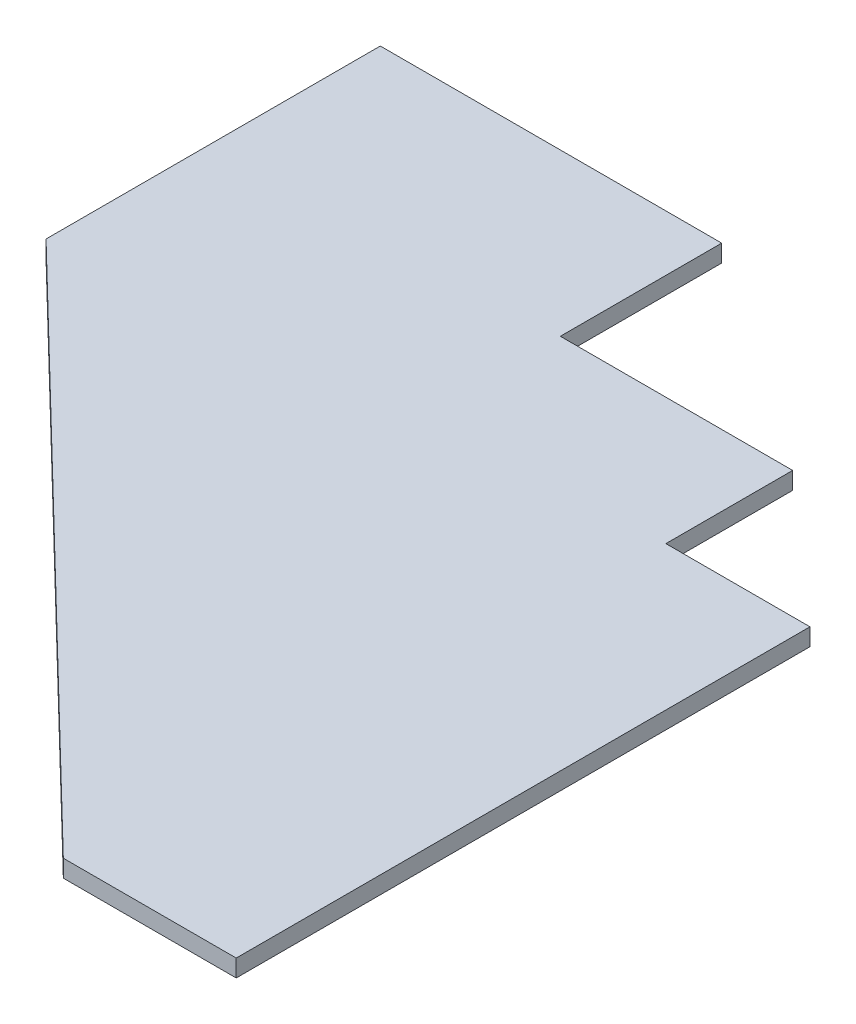
ISO-10303-21;
HEADER;
FILE_DESCRIPTION(('STEP AP214'),'2;1');
FILE_NAME('part.step','',(''),(''),'','','');
FILE_SCHEMA(('AUTOMOTIVE_DESIGN { 1 0 10303 214 1 1 1 1 }'));
ENDSEC;
DATA;
#1=APPLICATION_CONTEXT('core data for automotive mechanical design processes');
#2=APPLICATION_PROTOCOL_DEFINITION('international standard','automotive_design',2000,#1);
#3=PRODUCT_CONTEXT('',#1,'mechanical');
#4=PRODUCT('Part','Part','',(#3));
#5=PRODUCT_RELATED_PRODUCT_CATEGORY('part','',(#4));
#6=PRODUCT_DEFINITION_FORMATION('','',#4);
#7=PRODUCT_DEFINITION_CONTEXT('part definition',#1,'design');
#8=PRODUCT_DEFINITION('design','',#6,#7);
#9=PRODUCT_DEFINITION_SHAPE('','',#8);
#10=(LENGTH_UNIT() NAMED_UNIT(*) SI_UNIT(.MILLI.,.METRE.));
#11=(NAMED_UNIT(*) PLANE_ANGLE_UNIT() SI_UNIT($,.RADIAN.));
#12=(NAMED_UNIT(*) SI_UNIT($,.STERADIAN.) SOLID_ANGLE_UNIT());
#13=UNCERTAINTY_MEASURE_WITH_UNIT(LENGTH_MEASURE(1.E-05),#10,'distance_accuracy_value','');
#14=(GEOMETRIC_REPRESENTATION_CONTEXT(3) GLOBAL_UNCERTAINTY_ASSIGNED_CONTEXT((#13)) GLOBAL_UNIT_ASSIGNED_CONTEXT((#10,
#11,#12)) REPRESENTATION_CONTEXT('',''));
#15=CARTESIAN_POINT('',(0.,0.,0.));
#16=DIRECTION('',(0.,0.,1.));
#17=DIRECTION('',(1.,0.,0.));
#18=AXIS2_PLACEMENT_3D('',#15,#16,#17);
#19=CARTESIAN_POINT('',(-80.6264383179322,-6.,-43.9999999999994));
#20=DIRECTION('',(0.,0.,-1.));
#21=DIRECTION('',(-1.,0.,0.));
#22=AXIS2_PLACEMENT_3D('',#19,#20,#21);
#23=PLANE('',#22);
#24=DIRECTION('',(-1.,0.,0.));
#25=VECTOR('',#24,1.);
#26=CARTESIAN_POINT('',(-80.6264383179322,0.,-43.9999999999994));
#27=LINE('',#26,#25);
#28=CARTESIAN_POINT('',(0.,0.,-43.9999999999994));
#29=VERTEX_POINT('',#28);
#30=CARTESIAN_POINT('',(-80.6264383179322,0.,-43.9999999999994));
#31=VERTEX_POINT('',#30);
#32=EDGE_CURVE('E141',#29,#31,#27,.T.);
#33=ORIENTED_EDGE('',*,*,#32,.F.);
#34=DIRECTION('',(0.,1.,0.));
#35=VECTOR('',#34,1.);
#36=CARTESIAN_POINT('',(0.,-6.,-43.9999999999994));
#37=LINE('',#36,#35);
#38=CARTESIAN_POINT('',(0.,-6.,-43.9999999999994));
#39=VERTEX_POINT('',#38);
#40=EDGE_CURVE('E11',#39,#29,#37,.T.);
#41=ORIENTED_EDGE('',*,*,#40,.F.);
#42=DIRECTION('',(-1.,0.,0.));
#43=VECTOR('',#42,1.);
#44=CARTESIAN_POINT('',(-80.6264383179322,-6.,-43.9999999999994));
#45=LINE('',#44,#43);
#46=CARTESIAN_POINT('',(-80.6264383179322,-6.,-43.9999999999994));
#47=VERTEX_POINT('',#46);
#48=EDGE_CURVE('E164',#39,#47,#45,.T.);
#49=ORIENTED_EDGE('',*,*,#48,.T.);
#50=DIRECTION('',(0.,1.,0.));
#51=VECTOR('',#50,1.);
#52=CARTESIAN_POINT('',(-80.6264383179322,-6.,-43.9999999999994));
#53=LINE('',#52,#51);
#54=EDGE_CURVE('E41',#47,#31,#53,.T.);
#55=ORIENTED_EDGE('',*,*,#54,.T.);
#56=EDGE_LOOP('',(#33,#41,#49,#55));
#57=FACE_BOUND('',#56,.T.);
#58=ADVANCED_FACE('F38',(#57),#23,.T.);
#59=CARTESIAN_POINT('',(0.,-6.,-43.9999999999994));
#60=DIRECTION('',(1.,0.,0.));
#61=DIRECTION('',(0.,0.,-1.));
#62=AXIS2_PLACEMENT_3D('',#59,#60,#61);
#63=PLANE('',#62);
#64=DIRECTION('',(0.,0.,-1.));
#65=VECTOR('',#64,1.);
#66=CARTESIAN_POINT('',(0.,0.,-43.9999999999994));
#67=LINE('',#66,#65);
#68=CARTESIAN_POINT('',(0.,0.,-1.77774209247327E-12));
#69=VERTEX_POINT('',#68);
#70=EDGE_CURVE('E162',#69,#29,#67,.T.);
#71=ORIENTED_EDGE('',*,*,#70,.F.);
#72=DIRECTION('',(0.,1.,0.));
#73=VECTOR('',#72,1.);
#74=CARTESIAN_POINT('',(0.,-6.,-1.77774209247327E-12));
#75=LINE('',#74,#73);
#76=CARTESIAN_POINT('',(0.,-6.,-1.77774209247327E-12));
#77=VERTEX_POINT('',#76);
#78=EDGE_CURVE('E47',#77,#69,#75,.T.);
#79=ORIENTED_EDGE('',*,*,#78,.F.);
#80=DIRECTION('',(0.,0.,-1.));
#81=VECTOR('',#80,1.);
#82=CARTESIAN_POINT('',(0.,-6.,-43.9999999999994));
#83=LINE('',#82,#81);
#84=EDGE_CURVE('E131',#77,#39,#83,.T.);
#85=ORIENTED_EDGE('',*,*,#84,.T.);
#86=ORIENTED_EDGE('',*,*,#40,.T.);
#87=EDGE_LOOP('',(#71,#79,#85,#86));
#88=FACE_BOUND('',#87,.T.);
#89=ADVANCED_FACE('F179',(#88),#63,.T.);
#90=CARTESIAN_POINT('',(0.,-6.,-1.77774209247327E-12));
#91=DIRECTION('',(0.,0.,-1.));
#92=DIRECTION('',(-1.,0.,0.));
#93=AXIS2_PLACEMENT_3D('',#90,#91,#92);
#94=PLANE('',#93);
#95=DIRECTION('',(-1.,0.,0.));
#96=VECTOR('',#95,1.);
#97=CARTESIAN_POINT('',(0.,0.,-1.77774209247327E-12));
#98=LINE('',#97,#96);
#99=CARTESIAN_POINT('',(49.9999999999998,0.,-1.78248007339599E-12));
#100=VERTEX_POINT('',#99);
#101=EDGE_CURVE('E118',#100,#69,#98,.T.);
#102=ORIENTED_EDGE('',*,*,#101,.F.);
#103=DIRECTION('',(0.,1.,0.));
#104=VECTOR('',#103,1.);
#105=CARTESIAN_POINT('',(49.9999999999998,-6.,-1.78248007339599E-12));
#106=LINE('',#105,#104);
#107=CARTESIAN_POINT('',(49.9999999999998,-6.,-1.78248007339599E-12));
#108=VERTEX_POINT('',#107);
#109=EDGE_CURVE('E113',#108,#100,#106,.T.);
#110=ORIENTED_EDGE('',*,*,#109,.F.);
#111=DIRECTION('',(-1.,0.,0.));
#112=VECTOR('',#111,1.);
#113=CARTESIAN_POINT('',(0.,-6.,-1.77774209247327E-12));
#114=LINE('',#113,#112);
#115=EDGE_CURVE('E116',#108,#77,#114,.T.);
#116=ORIENTED_EDGE('',*,*,#115,.T.);
#117=ORIENTED_EDGE('',*,*,#78,.T.);
#118=EDGE_LOOP('',(#102,#110,#116,#117));
#119=FACE_BOUND('',#118,.T.);
#120=ADVANCED_FACE('F115',(#119),#94,.T.);
#121=CARTESIAN_POINT('',(49.9999999999998,-6.,-1.78248007339599E-12));
#122=DIRECTION('',(1.,0.,0.));
#123=DIRECTION('',(0.,0.,-1.));
#124=AXIS2_PLACEMENT_3D('',#121,#122,#123);
#125=PLANE('',#124);
#126=DIRECTION('',(0.,0.,-1.));
#127=VECTOR('',#126,1.);
#128=CARTESIAN_POINT('',(49.9999999999998,0.,-1.78248007339599E-12));
#129=LINE('',#128,#127);
#130=CARTESIAN_POINT('',(49.9999999999998,0.,199.111234032293));
#131=VERTEX_POINT('',#130);
#132=EDGE_CURVE('E159',#131,#100,#129,.T.);
#133=ORIENTED_EDGE('',*,*,#132,.F.);
#134=DIRECTION('',(0.,1.,0.));
#135=VECTOR('',#134,1.);
#136=CARTESIAN_POINT('',(49.9999999999998,-6.,199.111234032293));
#137=LINE('',#136,#135);
#138=CARTESIAN_POINT('',(49.9999999999998,-6.,199.111234032293));
#139=VERTEX_POINT('',#138);
#140=EDGE_CURVE('E123',#139,#131,#137,.T.);
#141=ORIENTED_EDGE('',*,*,#140,.F.);
#142=DIRECTION('',(0.,0.,-1.));
#143=VECTOR('',#142,1.);
#144=CARTESIAN_POINT('',(49.9999999999998,-6.,-1.78248007339599E-12));
#145=LINE('',#144,#143);
#146=EDGE_CURVE('E129',#139,#108,#145,.T.);
#147=ORIENTED_EDGE('',*,*,#146,.T.);
#148=ORIENTED_EDGE('',*,*,#109,.T.);
#149=EDGE_LOOP('',(#133,#141,#147,#148));
#150=FACE_BOUND('',#149,.T.);
#151=ADVANCED_FACE('F133',(#150),#125,.T.);
#152=CARTESIAN_POINT('',(49.9999999999998,-6.,199.111234032293));
#153=DIRECTION('',(0.,0.,1.));
#154=DIRECTION('',(1.,0.,0.));
#155=AXIS2_PLACEMENT_3D('',#152,#153,#154);
#156=PLANE('',#155);
#157=DIRECTION('',(1.,0.,0.));
#158=VECTOR('',#157,1.);
#159=CARTESIAN_POINT('',(49.9999999999998,0.,199.111234032293));
#160=LINE('',#159,#158);
#161=CARTESIAN_POINT('',(-10.,0.,199.111234032293));
#162=VERTEX_POINT('',#161);
#163=EDGE_CURVE('E156',#162,#131,#160,.T.);
#164=ORIENTED_EDGE('',*,*,#163,.F.);
#165=DIRECTION('',(0.,1.,0.));
#166=VECTOR('',#165,1.);
#167=CARTESIAN_POINT('',(-10.,-6.,199.111234032293));
#168=LINE('',#167,#166);
#169=CARTESIAN_POINT('',(-10.,-6.,199.111234032293));
#170=VERTEX_POINT('',#169);
#171=EDGE_CURVE('E168',#170,#162,#168,.T.);
#172=ORIENTED_EDGE('',*,*,#171,.F.);
#173=DIRECTION('',(1.,0.,0.));
#174=VECTOR('',#173,1.);
#175=CARTESIAN_POINT('',(49.9999999999998,-6.,199.111234032293));
#176=LINE('',#175,#174);
#177=EDGE_CURVE('E134',#170,#139,#176,.T.);
#178=ORIENTED_EDGE('',*,*,#177,.T.);
#179=ORIENTED_EDGE('',*,*,#140,.T.);
#180=EDGE_LOOP('',(#164,#172,#178,#179));
#181=FACE_BOUND('',#180,.T.);
#182=ADVANCED_FACE('F192',(#181),#156,.T.);
#183=CARTESIAN_POINT('',(-10.,-6.,199.111234032293));
#184=DIRECTION('',(-0.695618282503097,0.,0.718411584711328));
#185=DIRECTION('',(0.718411584711328,0.,0.695618282503097));
#186=AXIS2_PLACEMENT_3D('',#183,#184,#185);
#187=PLANE('',#186);
#188=DIRECTION('',(0.718411584711328,0.,0.695618282503097));
#189=VECTOR('',#188,1.);
#190=CARTESIAN_POINT('',(-10.,0.,199.111234032293));
#191=LINE('',#190,#189);
#192=CARTESIAN_POINT('',(-199.111234032295,0.,16.0000000000004));
#193=VERTEX_POINT('',#192);
#194=EDGE_CURVE('E153',#193,#162,#191,.T.);
#195=ORIENTED_EDGE('',*,*,#194,.F.);
#196=DIRECTION('',(0.,1.,0.));
#197=VECTOR('',#196,1.);
#198=CARTESIAN_POINT('',(-199.111234032295,-6.,16.0000000000004));
#199=LINE('',#198,#197);
#200=CARTESIAN_POINT('',(-199.111234032295,-6.,16.0000000000004));
#201=VERTEX_POINT('',#200);
#202=EDGE_CURVE('E170',#201,#193,#199,.T.);
#203=ORIENTED_EDGE('',*,*,#202,.F.);
#204=DIRECTION('',(0.718411584711328,0.,0.695618282503097));
#205=VECTOR('',#204,1.);
#206=CARTESIAN_POINT('',(-10.,-6.,199.111234032293));
#207=LINE('',#206,#205);
#208=EDGE_CURVE('E136',#201,#170,#207,.T.);
#209=ORIENTED_EDGE('',*,*,#208,.T.);
#210=ORIENTED_EDGE('',*,*,#171,.T.);
#211=EDGE_LOOP('',(#195,#203,#209,#210));
#212=FACE_BOUND('',#211,.T.);
#213=ADVANCED_FACE('F195',(#212),#187,.T.);
#214=CARTESIAN_POINT('',(-199.111234032295,-6.,16.0000000000004));
#215=DIRECTION('',(-1.,0.,0.));
#216=DIRECTION('',(0.,0.,1.));
#217=AXIS2_PLACEMENT_3D('',#214,#215,#216);
#218=PLANE('',#217);
#219=DIRECTION('',(0.,0.,1.));
#220=VECTOR('',#219,1.);
#221=CARTESIAN_POINT('',(-199.111234032295,0.,16.0000000000004));
#222=LINE('',#221,#220);
#223=CARTESIAN_POINT('',(-199.111234032295,0.,-100.000000000001));
#224=VERTEX_POINT('',#223);
#225=EDGE_CURVE('E150',#224,#193,#222,.T.);
#226=ORIENTED_EDGE('',*,*,#225,.F.);
#227=DIRECTION('',(0.,1.,0.));
#228=VECTOR('',#227,1.);
#229=CARTESIAN_POINT('',(-199.111234032295,-6.,-100.000000000001));
#230=LINE('',#229,#228);
#231=CARTESIAN_POINT('',(-199.111234032295,-6.,-100.000000000001));
#232=VERTEX_POINT('',#231);
#233=EDGE_CURVE('E172',#232,#224,#230,.T.);
#234=ORIENTED_EDGE('',*,*,#233,.F.);
#235=DIRECTION('',(0.,0.,1.));
#236=VECTOR('',#235,1.);
#237=CARTESIAN_POINT('',(-199.111234032295,-6.,-100.000000000001));
#238=LINE('',#237,#236);
#239=EDGE_CURVE('E304',#232,#201,#238,.T.);
#240=ORIENTED_EDGE('',*,*,#239,.T.);
#241=ORIENTED_EDGE('',*,*,#202,.T.);
#242=EDGE_LOOP('',(#226,#234,#240,#241));
#243=FACE_BOUND('',#242,.T.);
#244=ADVANCED_FACE('F199',(#243),#218,.T.);
#245=CARTESIAN_POINT('',(-80.6264383179323,-6.,-100.000000000001));
#246=DIRECTION('',(0.,0.,-1.));
#247=DIRECTION('',(-1.,0.,0.));
#248=AXIS2_PLACEMENT_3D('',#245,#246,#247);
#249=PLANE('',#248);
#250=DIRECTION('',(-1.,0.,0.));
#251=VECTOR('',#250,1.);
#252=CARTESIAN_POINT('',(-80.6264383179323,0.,-100.000000000001));
#253=LINE('',#252,#251);
#254=CARTESIAN_POINT('',(-80.6264383179323,0.,-100.000000000001));
#255=VERTEX_POINT('',#254);
#256=EDGE_CURVE('E147',#255,#224,#253,.T.);
#257=ORIENTED_EDGE('',*,*,#256,.F.);
#258=DIRECTION('',(0.,1.,0.));
#259=VECTOR('',#258,1.);
#260=CARTESIAN_POINT('',(-80.6264383179323,-6.,-100.000000000001));
#261=LINE('',#260,#259);
#262=CARTESIAN_POINT('',(-80.6264383179323,-6.,-100.000000000001));
#263=VERTEX_POINT('',#262);
#264=EDGE_CURVE('E174',#263,#255,#261,.T.);
#265=ORIENTED_EDGE('',*,*,#264,.F.);
#266=DIRECTION('',(-1.,0.,0.));
#267=VECTOR('',#266,1.);
#268=CARTESIAN_POINT('',(-80.6264383179323,-6.,-100.000000000001));
#269=LINE('',#268,#267);
#270=EDGE_CURVE('E308',#263,#232,#269,.T.);
#271=ORIENTED_EDGE('',*,*,#270,.T.);
#272=ORIENTED_EDGE('',*,*,#233,.T.);
#273=EDGE_LOOP('',(#257,#265,#271,#272));
#274=FACE_BOUND('',#273,.T.);
#275=ADVANCED_FACE('F203',(#274),#249,.T.);
#276=CARTESIAN_POINT('',(-80.6264383179322,-6.,-43.9999999999994));
#277=DIRECTION('',(1.,0.,0.));
#278=DIRECTION('',(0.,0.,-1.));
#279=AXIS2_PLACEMENT_3D('',#276,#277,#278);
#280=PLANE('',#279);
#281=DIRECTION('',(0.,0.,-1.));
#282=VECTOR('',#281,1.);
#283=CARTESIAN_POINT('',(-80.6264383179322,0.,-43.9999999999994));
#284=LINE('',#283,#282);
#285=EDGE_CURVE('E144',#31,#255,#284,.T.);
#286=ORIENTED_EDGE('',*,*,#285,.F.);
#287=ORIENTED_EDGE('',*,*,#54,.F.);
#288=DIRECTION('',(0.,0.,-1.));
#289=VECTOR('',#288,1.);
#290=CARTESIAN_POINT('',(-80.6264383179322,-6.,-43.9999999999994));
#291=LINE('',#290,#289);
#292=EDGE_CURVE('E312',#47,#263,#291,.T.);
#293=ORIENTED_EDGE('',*,*,#292,.T.);
#294=ORIENTED_EDGE('',*,*,#264,.T.);
#295=EDGE_LOOP('',(#286,#287,#293,#294));
#296=FACE_BOUND('',#295,.T.);
#297=ADVANCED_FACE('F176',(#296),#280,.T.);
#298=CARTESIAN_POINT('',(0.,-6.,0.));
#299=DIRECTION('',(0.,-1.,0.));
#300=DIRECTION('',(0.,0.,-1.));
#301=AXIS2_PLACEMENT_3D('',#298,#299,#300);
#302=PLANE('',#301);
#303=ORIENTED_EDGE('',*,*,#48,.F.);
#304=ORIENTED_EDGE('',*,*,#84,.F.);
#305=ORIENTED_EDGE('',*,*,#115,.F.);
#306=ORIENTED_EDGE('',*,*,#146,.F.);
#307=ORIENTED_EDGE('',*,*,#177,.F.);
#308=ORIENTED_EDGE('',*,*,#208,.F.);
#309=ORIENTED_EDGE('',*,*,#239,.F.);
#310=ORIENTED_EDGE('',*,*,#270,.F.);
#311=ORIENTED_EDGE('',*,*,#292,.F.);
#312=EDGE_LOOP('',(#303,#304,#305,#306,#307,#308,#309,#310,#311));
#313=FACE_BOUND('',#312,.T.);
#314=ADVANCED_FACE('F127',(#313),#302,.T.);
#315=CARTESIAN_POINT('',(0.,0.,0.));
#316=DIRECTION('',(0.,-1.,0.));
#317=DIRECTION('',(0.,0.,-1.));
#318=AXIS2_PLACEMENT_3D('',#315,#316,#317);
#319=PLANE('',#318);
#320=ORIENTED_EDGE('',*,*,#32,.T.);
#321=ORIENTED_EDGE('',*,*,#285,.T.);
#322=ORIENTED_EDGE('',*,*,#256,.T.);
#323=ORIENTED_EDGE('',*,*,#225,.T.);
#324=ORIENTED_EDGE('',*,*,#194,.T.);
#325=ORIENTED_EDGE('',*,*,#163,.T.);
#326=ORIENTED_EDGE('',*,*,#132,.T.);
#327=ORIENTED_EDGE('',*,*,#101,.T.);
#328=ORIENTED_EDGE('',*,*,#70,.T.);
#329=EDGE_LOOP('',(#320,#321,#322,#323,#324,#325,#326,#327,#328));
#330=FACE_BOUND('',#329,.T.);
#331=ADVANCED_FACE('F178',(#330),#319,.F.);
#332=CLOSED_SHELL('',(#58,#89,#120,#151,#182,#213,#244,#275,#297,#314,#331));
#333=MANIFOLD_SOLID_BREP('B2',#332);
#334=ADVANCED_BREP_SHAPE_REPRESENTATION('',(#18,#333),#14);
#335=SHAPE_DEFINITION_REPRESENTATION(#9,#334);
ENDSEC;
END-ISO-10303-21;
